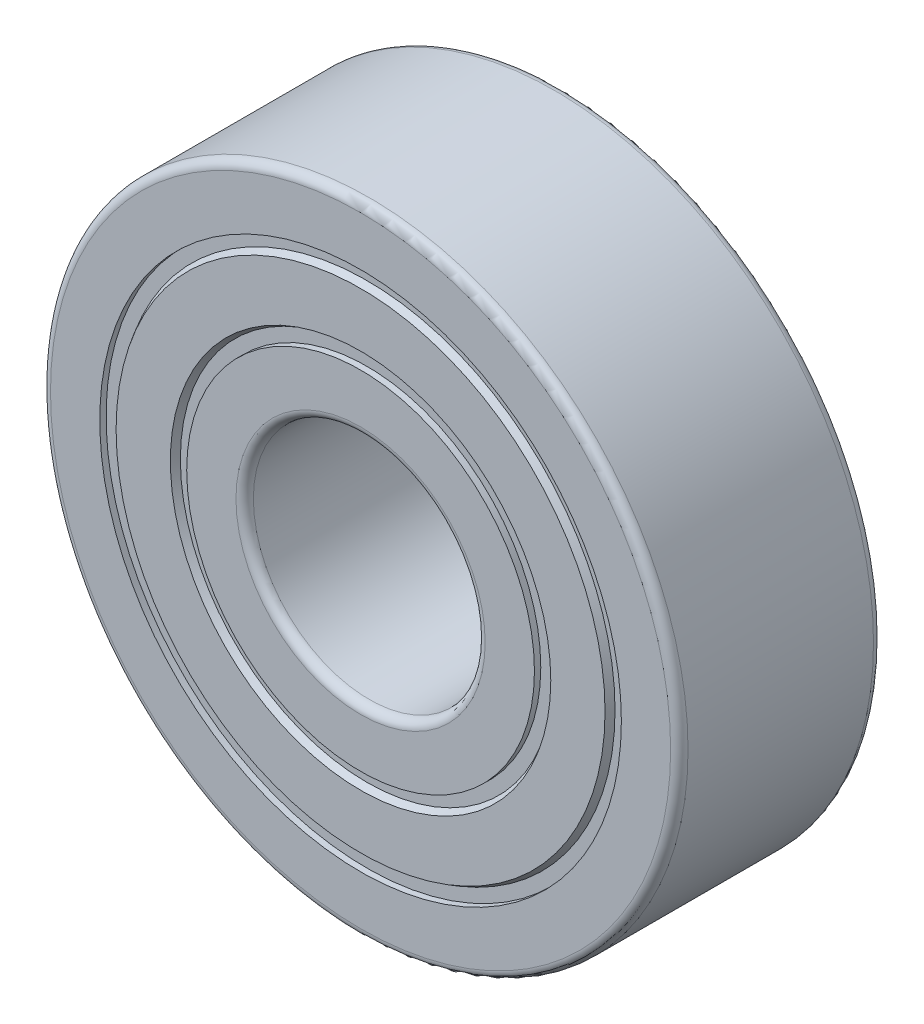
ISO-10303-21;
HEADER;
FILE_DESCRIPTION(('STEP AP214'),'2;1');
FILE_NAME('part.step','',(''),(''),'','','');
FILE_SCHEMA(('AUTOMOTIVE_DESIGN { 1 0 10303 214 1 1 1 1 }'));
ENDSEC;
DATA;
#1=APPLICATION_CONTEXT('core data for automotive mechanical design processes');
#2=APPLICATION_PROTOCOL_DEFINITION('international standard','automotive_design',2000,#1);
#3=PRODUCT_CONTEXT('',#1,'mechanical');
#4=PRODUCT('Part','Part','',(#3));
#5=PRODUCT_RELATED_PRODUCT_CATEGORY('part','',(#4));
#6=PRODUCT_DEFINITION_FORMATION('','',#4);
#7=PRODUCT_DEFINITION_CONTEXT('part definition',#1,'design');
#8=PRODUCT_DEFINITION('design','',#6,#7);
#9=PRODUCT_DEFINITION_SHAPE('','',#8);
#10=(LENGTH_UNIT() NAMED_UNIT(*) SI_UNIT(.MILLI.,.METRE.));
#11=(NAMED_UNIT(*) PLANE_ANGLE_UNIT() SI_UNIT($,.RADIAN.));
#12=(NAMED_UNIT(*) SI_UNIT($,.STERADIAN.) SOLID_ANGLE_UNIT());
#13=UNCERTAINTY_MEASURE_WITH_UNIT(LENGTH_MEASURE(1.E-05),#10,'distance_accuracy_value','');
#14=(GEOMETRIC_REPRESENTATION_CONTEXT(3) GLOBAL_UNCERTAINTY_ASSIGNED_CONTEXT((#13)) GLOBAL_UNIT_ASSIGNED_CONTEXT((#10,
#11,#12)) REPRESENTATION_CONTEXT('',''));
#15=CARTESIAN_POINT('',(0.,0.,0.));
#16=DIRECTION('',(0.,0.,1.));
#17=DIRECTION('',(1.,0.,0.));
#18=AXIS2_PLACEMENT_3D('',#15,#16,#17);
#19=CARTESIAN_POINT('',(-9.,0.,7.));
#20=DIRECTION('',(0.,0.,-1.));
#21=DIRECTION('',(-1.,0.,0.));
#22=AXIS2_PLACEMENT_3D('',#19,#20,#21);
#23=PLANE('',#22);
#24=CARTESIAN_POINT('',(0.,0.,7.));
#25=DIRECTION('',(0.,0.,1.));
#26=DIRECTION('',(1.,0.,0.));
#27=AXIS2_PLACEMENT_3D('',#24,#25,#26);
#28=CIRCLE('',#27,9.);
#29=CARTESIAN_POINT('',(9.,0.,7.));
#30=VERTEX_POINT('',#29);
#31=EDGE_CURVE('E10',#30,#30,#28,.T.);
#32=ORIENTED_EDGE('',*,*,#31,.F.);
#33=EDGE_LOOP('',(#32));
#34=FACE_BOUND('',#33,.T.);
#35=CARTESIAN_POINT('',(0.,0.,7.));
#36=DIRECTION('',(0.,0.,1.));
#37=DIRECTION('',(1.,0.,0.));
#38=AXIS2_PLACEMENT_3D('',#35,#36,#37);
#39=CIRCLE('',#38,10.7);
#40=CARTESIAN_POINT('',(10.7,0.,7.));
#41=VERTEX_POINT('',#40);
#42=EDGE_CURVE('E110',#41,#41,#39,.T.);
#43=ORIENTED_EDGE('',*,*,#42,.T.);
#44=EDGE_LOOP('',(#43));
#45=FACE_BOUND('',#44,.T.);
#46=ADVANCED_FACE('F33',(#34,#45),#23,.F.);
#47=CARTESIAN_POINT('',(0.,0.,19.));
#48=DIRECTION('',(0.,0.,1.));
#49=DIRECTION('',(1.,0.,0.));
#50=AXIS2_PLACEMENT_3D('',#47,#48,#49);
#51=CYLINDRICAL_SURFACE('',#50,9.);
#52=CARTESIAN_POINT('',(0.,0.,6.78125));
#53=DIRECTION('',(0.,0.,1.));
#54=DIRECTION('',(1.,0.,0.));
#55=AXIS2_PLACEMENT_3D('',#52,#53,#54);
#56=CIRCLE('',#55,9.);
#57=CARTESIAN_POINT('',(9.,0.,6.78125));
#58=VERTEX_POINT('',#57);
#59=EDGE_CURVE('E40',#58,#58,#56,.T.);
#60=ORIENTED_EDGE('',*,*,#59,.F.);
#61=EDGE_LOOP('',(#60));
#62=FACE_BOUND('',#61,.T.);
#63=ORIENTED_EDGE('',*,*,#31,.T.);
#64=EDGE_LOOP('',(#63));
#65=FACE_BOUND('',#64,.T.);
#66=ADVANCED_FACE('F243',(#62,#65),#51,.F.);
#67=CARTESIAN_POINT('',(-9.,0.,6.78125));
#68=DIRECTION('',(0.,0.,-1.));
#69=DIRECTION('',(-1.,0.,0.));
#70=AXIS2_PLACEMENT_3D('',#67,#68,#69);
#71=PLANE('',#70);
#72=CARTESIAN_POINT('',(0.,0.,6.78125));
#73=DIRECTION('',(0.,0.,1.));
#74=DIRECTION('',(1.,0.,0.));
#75=AXIS2_PLACEMENT_3D('',#72,#73,#74);
#76=CIRCLE('',#75,8.5625);
#77=CARTESIAN_POINT('',(8.5625,0.,6.78125));
#78=VERTEX_POINT('',#77);
#79=EDGE_CURVE('E44',#78,#78,#76,.T.);
#80=ORIENTED_EDGE('',*,*,#79,.F.);
#81=EDGE_LOOP('',(#80));
#82=FACE_BOUND('',#81,.T.);
#83=ORIENTED_EDGE('',*,*,#59,.T.);
#84=EDGE_LOOP('',(#83));
#85=FACE_BOUND('',#84,.T.);
#86=ADVANCED_FACE('F238',(#82,#85),#71,.F.);
#87=CARTESIAN_POINT('',(0.,0.,6.78125));
#88=DIRECTION('',(0.,0.,-1.));
#89=DIRECTION('',(-1.,0.,0.));
#90=AXIS2_PLACEMENT_3D('',#87,#88,#89);
#91=CONICAL_SURFACE('',#90,8.5625,0.523598775598308);
#92=CARTESIAN_POINT('',(0.,0.,7.));
#93=DIRECTION('',(0.,0.,1.));
#94=DIRECTION('',(1.,0.,0.));
#95=AXIS2_PLACEMENT_3D('',#92,#93,#94);
#96=CIRCLE('',#95,8.43620462861477);
#97=CARTESIAN_POINT('',(8.43620462861477,0.,7.));
#98=VERTEX_POINT('',#97);
#99=EDGE_CURVE('E48',#98,#98,#96,.T.);
#100=ORIENTED_EDGE('',*,*,#99,.F.);
#101=EDGE_LOOP('',(#100));
#102=FACE_BOUND('',#101,.T.);
#103=ORIENTED_EDGE('',*,*,#79,.T.);
#104=EDGE_LOOP('',(#103));
#105=FACE_BOUND('',#104,.T.);
#106=ADVANCED_FACE('F232',(#102,#105),#91,.T.);
#107=CARTESIAN_POINT('',(-8.43620462861477,0.,7.));
#108=DIRECTION('',(0.,0.,-1.));
#109=DIRECTION('',(-1.,0.,0.));
#110=AXIS2_PLACEMENT_3D('',#107,#108,#109);
#111=PLANE('',#110);
#112=CARTESIAN_POINT('',(0.,0.,7.));
#113=DIRECTION('',(0.,0.,1.));
#114=DIRECTION('',(1.,0.,0.));
#115=AXIS2_PLACEMENT_3D('',#112,#113,#114);
#116=CIRCLE('',#115,6.56379537138523);
#117=CARTESIAN_POINT('',(6.56379537138523,0.,7.));
#118=VERTEX_POINT('',#117);
#119=EDGE_CURVE('E53',#118,#118,#116,.T.);
#120=ORIENTED_EDGE('',*,*,#119,.F.);
#121=EDGE_LOOP('',(#120));
#122=FACE_BOUND('',#121,.T.);
#123=ORIENTED_EDGE('',*,*,#99,.T.);
#124=EDGE_LOOP('',(#123));
#125=FACE_BOUND('',#124,.T.);
#126=ADVANCED_FACE('F226',(#122,#125),#111,.F.);
#127=CARTESIAN_POINT('',(0.,0.,7.));
#128=DIRECTION('',(0.,0.,1.));
#129=DIRECTION('',(1.,0.,0.));
#130=AXIS2_PLACEMENT_3D('',#127,#128,#129);
#131=CONICAL_SURFACE('',#130,6.56379537138523,0.523598775598303);
#132=CARTESIAN_POINT('',(0.,0.,6.78125));
#133=DIRECTION('',(0.,0.,1.));
#134=DIRECTION('',(1.,0.,0.));
#135=AXIS2_PLACEMENT_3D('',#132,#133,#134);
#136=CIRCLE('',#135,6.4375);
#137=CARTESIAN_POINT('',(6.4375,0.,6.78125));
#138=VERTEX_POINT('',#137);
#139=EDGE_CURVE('E56',#138,#138,#136,.T.);
#140=ORIENTED_EDGE('',*,*,#139,.F.);
#141=EDGE_LOOP('',(#140));
#142=FACE_BOUND('',#141,.T.);
#143=ORIENTED_EDGE('',*,*,#119,.T.);
#144=EDGE_LOOP('',(#143));
#145=FACE_BOUND('',#144,.T.);
#146=ADVANCED_FACE('F220',(#142,#145),#131,.F.);
#147=CARTESIAN_POINT('',(-6.,0.,6.78125));
#148=DIRECTION('',(0.,0.,-1.));
#149=DIRECTION('',(-1.,0.,0.));
#150=AXIS2_PLACEMENT_3D('',#147,#148,#149);
#151=PLANE('',#150);
#152=CARTESIAN_POINT('',(0.,0.,6.78125));
#153=DIRECTION('',(0.,0.,1.));
#154=DIRECTION('',(1.,0.,0.));
#155=AXIS2_PLACEMENT_3D('',#152,#153,#154);
#156=CIRCLE('',#155,6.);
#157=CARTESIAN_POINT('',(6.,0.,6.78125));
#158=VERTEX_POINT('',#157);
#159=EDGE_CURVE('E59',#158,#158,#156,.T.);
#160=ORIENTED_EDGE('',*,*,#159,.F.);
#161=EDGE_LOOP('',(#160));
#162=FACE_BOUND('',#161,.T.);
#163=ORIENTED_EDGE('',*,*,#139,.T.);
#164=EDGE_LOOP('',(#163));
#165=FACE_BOUND('',#164,.T.);
#166=ADVANCED_FACE('F214',(#162,#165),#151,.F.);
#167=CARTESIAN_POINT('',(0.,0.,19.));
#168=DIRECTION('',(0.,0.,1.));
#169=DIRECTION('',(1.,0.,0.));
#170=AXIS2_PLACEMENT_3D('',#167,#168,#169);
#171=CYLINDRICAL_SURFACE('',#170,6.);
#172=CARTESIAN_POINT('',(0.,0.,7.));
#173=DIRECTION('',(0.,0.,1.));
#174=DIRECTION('',(1.,0.,0.));
#175=AXIS2_PLACEMENT_3D('',#172,#173,#174);
#176=CIRCLE('',#175,6.);
#177=CARTESIAN_POINT('',(6.,0.,7.));
#178=VERTEX_POINT('',#177);
#179=EDGE_CURVE('E62',#178,#178,#176,.T.);
#180=ORIENTED_EDGE('',*,*,#179,.F.);
#181=EDGE_LOOP('',(#180));
#182=FACE_BOUND('',#181,.T.);
#183=ORIENTED_EDGE('',*,*,#159,.T.);
#184=EDGE_LOOP('',(#183));
#185=FACE_BOUND('',#184,.T.);
#186=ADVANCED_FACE('F208',(#182,#185),#171,.T.);
#187=CARTESIAN_POINT('',(-4.3,0.,7.));
#188=DIRECTION('',(0.,0.,-1.));
#189=DIRECTION('',(-1.,0.,0.));
#190=AXIS2_PLACEMENT_3D('',#187,#188,#189);
#191=PLANE('',#190);
#192=CARTESIAN_POINT('',(0.,0.,7.));
#193=DIRECTION('',(0.,0.,1.));
#194=DIRECTION('',(1.,0.,0.));
#195=AXIS2_PLACEMENT_3D('',#192,#193,#194);
#196=CIRCLE('',#195,4.3);
#197=CARTESIAN_POINT('',(4.3,0.,7.));
#198=VERTEX_POINT('',#197);
#199=EDGE_CURVE('E65',#198,#198,#196,.T.);
#200=ORIENTED_EDGE('',*,*,#199,.F.);
#201=EDGE_LOOP('',(#200));
#202=FACE_BOUND('',#201,.T.);
#203=ORIENTED_EDGE('',*,*,#179,.T.);
#204=EDGE_LOOP('',(#203));
#205=FACE_BOUND('',#204,.T.);
#206=ADVANCED_FACE('F202',(#202,#205),#191,.F.);
#207=CARTESIAN_POINT('',(0.,0.,6.7));
#208=DIRECTION('',(0.,0.,1.));
#209=DIRECTION('',(1.,0.,0.));
#210=AXIS2_PLACEMENT_3D('',#207,#208,#209);
#211=TOROIDAL_SURFACE('',#210,4.3,0.3);
#212=CARTESIAN_POINT('',(0.,0.,6.7));
#213=DIRECTION('',(0.,0.,1.));
#214=DIRECTION('',(1.,0.,0.));
#215=AXIS2_PLACEMENT_3D('',#212,#213,#214);
#216=CIRCLE('',#215,4.);
#217=CARTESIAN_POINT('',(4.,0.,6.7));
#218=VERTEX_POINT('',#217);
#219=EDGE_CURVE('E68',#218,#218,#216,.T.);
#220=ORIENTED_EDGE('',*,*,#219,.F.);
#221=EDGE_LOOP('',(#220));
#222=FACE_BOUND('',#221,.T.);
#223=ORIENTED_EDGE('',*,*,#199,.T.);
#224=EDGE_LOOP('',(#223));
#225=FACE_BOUND('',#224,.T.);
#226=ADVANCED_FACE('F196',(#222,#225),#211,.T.);
#227=CARTESIAN_POINT('',(0.,0.,19.));
#228=DIRECTION('',(0.,0.,1.));
#229=DIRECTION('',(1.,0.,0.));
#230=AXIS2_PLACEMENT_3D('',#227,#228,#229);
#231=CYLINDRICAL_SURFACE('',#230,4.);
#232=CARTESIAN_POINT('',(0.,0.,0.300000000000002));
#233=DIRECTION('',(0.,0.,1.));
#234=DIRECTION('',(1.,0.,0.));
#235=AXIS2_PLACEMENT_3D('',#232,#233,#234);
#236=CIRCLE('',#235,4.);
#237=CARTESIAN_POINT('',(4.,0.,0.300000000000002));
#238=VERTEX_POINT('',#237);
#239=EDGE_CURVE('E71',#238,#238,#236,.T.);
#240=ORIENTED_EDGE('',*,*,#239,.F.);
#241=EDGE_LOOP('',(#240));
#242=FACE_BOUND('',#241,.T.);
#243=ORIENTED_EDGE('',*,*,#219,.T.);
#244=EDGE_LOOP('',(#243));
#245=FACE_BOUND('',#244,.T.);
#246=ADVANCED_FACE('F190',(#242,#245),#231,.F.);
#247=CARTESIAN_POINT('',(0.,0.,0.300000000000001));
#248=DIRECTION('',(0.,0.,1.));
#249=DIRECTION('',(1.,0.,0.));
#250=AXIS2_PLACEMENT_3D('',#247,#248,#249);
#251=TOROIDAL_SURFACE('',#250,4.3,0.3);
#252=CARTESIAN_POINT('',(0.,0.,0.));
#253=DIRECTION('',(0.,0.,1.));
#254=DIRECTION('',(1.,0.,0.));
#255=AXIS2_PLACEMENT_3D('',#252,#253,#254);
#256=CIRCLE('',#255,4.3);
#257=CARTESIAN_POINT('',(4.3,0.,0.));
#258=VERTEX_POINT('',#257);
#259=EDGE_CURVE('E74',#258,#258,#256,.T.);
#260=ORIENTED_EDGE('',*,*,#259,.F.);
#261=EDGE_LOOP('',(#260));
#262=FACE_BOUND('',#261,.T.);
#263=ORIENTED_EDGE('',*,*,#239,.T.);
#264=EDGE_LOOP('',(#263));
#265=FACE_BOUND('',#264,.T.);
#266=ADVANCED_FACE('F184',(#262,#265),#251,.T.);
#267=CARTESIAN_POINT('',(-4.3,0.,0.));
#268=DIRECTION('',(0.,0.,1.));
#269=DIRECTION('',(1.,0.,0.));
#270=AXIS2_PLACEMENT_3D('',#267,#268,#269);
#271=PLANE('',#270);
#272=CARTESIAN_POINT('',(0.,0.,0.));
#273=DIRECTION('',(0.,0.,1.));
#274=DIRECTION('',(1.,0.,0.));
#275=AXIS2_PLACEMENT_3D('',#272,#273,#274);
#276=CIRCLE('',#275,6.);
#277=CARTESIAN_POINT('',(6.,0.,0.));
#278=VERTEX_POINT('',#277);
#279=EDGE_CURVE('E77',#278,#278,#276,.T.);
#280=ORIENTED_EDGE('',*,*,#279,.F.);
#281=EDGE_LOOP('',(#280));
#282=FACE_BOUND('',#281,.T.);
#283=ORIENTED_EDGE('',*,*,#259,.T.);
#284=EDGE_LOOP('',(#283));
#285=FACE_BOUND('',#284,.T.);
#286=ADVANCED_FACE('F178',(#282,#285),#271,.F.);
#287=CARTESIAN_POINT('',(0.,0.,19.));
#288=DIRECTION('',(0.,0.,1.));
#289=DIRECTION('',(1.,0.,0.));
#290=AXIS2_PLACEMENT_3D('',#287,#288,#289);
#291=CYLINDRICAL_SURFACE('',#290,6.);
#292=CARTESIAN_POINT('',(0.,0.,0.21875));
#293=DIRECTION('',(0.,0.,1.));
#294=DIRECTION('',(1.,0.,0.));
#295=AXIS2_PLACEMENT_3D('',#292,#293,#294);
#296=CIRCLE('',#295,6.);
#297=CARTESIAN_POINT('',(6.,0.,0.21875));
#298=VERTEX_POINT('',#297);
#299=EDGE_CURVE('E80',#298,#298,#296,.T.);
#300=ORIENTED_EDGE('',*,*,#299,.F.);
#301=EDGE_LOOP('',(#300));
#302=FACE_BOUND('',#301,.T.);
#303=ORIENTED_EDGE('',*,*,#279,.T.);
#304=EDGE_LOOP('',(#303));
#305=FACE_BOUND('',#304,.T.);
#306=ADVANCED_FACE('F172',(#302,#305),#291,.T.);
#307=CARTESIAN_POINT('',(-6.,0.,0.21875));
#308=DIRECTION('',(0.,0.,1.));
#309=DIRECTION('',(1.,0.,0.));
#310=AXIS2_PLACEMENT_3D('',#307,#308,#309);
#311=PLANE('',#310);
#312=CARTESIAN_POINT('',(0.,0.,0.21875));
#313=DIRECTION('',(0.,0.,1.));
#314=DIRECTION('',(1.,0.,0.));
#315=AXIS2_PLACEMENT_3D('',#312,#313,#314);
#316=CIRCLE('',#315,6.4375);
#317=CARTESIAN_POINT('',(6.4375,0.,0.21875));
#318=VERTEX_POINT('',#317);
#319=EDGE_CURVE('E83',#318,#318,#316,.T.);
#320=ORIENTED_EDGE('',*,*,#319,.F.);
#321=EDGE_LOOP('',(#320));
#322=FACE_BOUND('',#321,.T.);
#323=ORIENTED_EDGE('',*,*,#299,.T.);
#324=EDGE_LOOP('',(#323));
#325=FACE_BOUND('',#324,.T.);
#326=ADVANCED_FACE('F166',(#322,#325),#311,.F.);
#327=CARTESIAN_POINT('',(0.,0.,0.21875));
#328=DIRECTION('',(0.,0.,-1.));
#329=DIRECTION('',(-1.,0.,0.));
#330=AXIS2_PLACEMENT_3D('',#327,#328,#329);
#331=CONICAL_SURFACE('',#330,6.4375,0.523598775598303);
#332=CARTESIAN_POINT('',(0.,0.,0.));
#333=DIRECTION('',(0.,0.,1.));
#334=DIRECTION('',(1.,0.,0.));
#335=AXIS2_PLACEMENT_3D('',#332,#333,#334);
#336=CIRCLE('',#335,6.56379537138523);
#337=CARTESIAN_POINT('',(6.56379537138523,0.,0.));
#338=VERTEX_POINT('',#337);
#339=EDGE_CURVE('E86',#338,#338,#336,.T.);
#340=ORIENTED_EDGE('',*,*,#339,.F.);
#341=EDGE_LOOP('',(#340));
#342=FACE_BOUND('',#341,.T.);
#343=ORIENTED_EDGE('',*,*,#319,.T.);
#344=EDGE_LOOP('',(#343));
#345=FACE_BOUND('',#344,.T.);
#346=ADVANCED_FACE('F160',(#342,#345),#331,.F.);
#347=CARTESIAN_POINT('',(-8.43620462861477,0.,0.));
#348=DIRECTION('',(0.,0.,1.));
#349=DIRECTION('',(1.,0.,0.));
#350=AXIS2_PLACEMENT_3D('',#347,#348,#349);
#351=PLANE('',#350);
#352=CARTESIAN_POINT('',(0.,0.,0.));
#353=DIRECTION('',(0.,0.,1.));
#354=DIRECTION('',(1.,0.,0.));
#355=AXIS2_PLACEMENT_3D('',#352,#353,#354);
#356=CIRCLE('',#355,8.43620462861477);
#357=CARTESIAN_POINT('',(8.43620462861477,0.,0.));
#358=VERTEX_POINT('',#357);
#359=EDGE_CURVE('E89',#358,#358,#356,.T.);
#360=ORIENTED_EDGE('',*,*,#359,.F.);
#361=EDGE_LOOP('',(#360));
#362=FACE_BOUND('',#361,.T.);
#363=ORIENTED_EDGE('',*,*,#339,.T.);
#364=EDGE_LOOP('',(#363));
#365=FACE_BOUND('',#364,.T.);
#366=ADVANCED_FACE('F154',(#362,#365),#351,.F.);
#367=CARTESIAN_POINT('',(0.,0.,0.));
#368=DIRECTION('',(0.,0.,1.));
#369=DIRECTION('',(1.,0.,0.));
#370=AXIS2_PLACEMENT_3D('',#367,#368,#369);
#371=CONICAL_SURFACE('',#370,8.43620462861477,0.523598775598308);
#372=CARTESIAN_POINT('',(0.,0.,0.21875));
#373=DIRECTION('',(0.,0.,1.));
#374=DIRECTION('',(1.,0.,0.));
#375=AXIS2_PLACEMENT_3D('',#372,#373,#374);
#376=CIRCLE('',#375,8.5625);
#377=CARTESIAN_POINT('',(8.5625,0.,0.21875));
#378=VERTEX_POINT('',#377);
#379=EDGE_CURVE('E92',#378,#378,#376,.T.);
#380=ORIENTED_EDGE('',*,*,#379,.F.);
#381=EDGE_LOOP('',(#380));
#382=FACE_BOUND('',#381,.T.);
#383=ORIENTED_EDGE('',*,*,#359,.T.);
#384=EDGE_LOOP('',(#383));
#385=FACE_BOUND('',#384,.T.);
#386=ADVANCED_FACE('F148',(#382,#385),#371,.T.);
#387=CARTESIAN_POINT('',(-9.,0.,0.21875));
#388=DIRECTION('',(0.,0.,1.));
#389=DIRECTION('',(1.,0.,0.));
#390=AXIS2_PLACEMENT_3D('',#387,#388,#389);
#391=PLANE('',#390);
#392=CARTESIAN_POINT('',(0.,0.,0.21875));
#393=DIRECTION('',(0.,0.,1.));
#394=DIRECTION('',(1.,0.,0.));
#395=AXIS2_PLACEMENT_3D('',#392,#393,#394);
#396=CIRCLE('',#395,9.);
#397=CARTESIAN_POINT('',(9.,0.,0.21875));
#398=VERTEX_POINT('',#397);
#399=EDGE_CURVE('E95',#398,#398,#396,.T.);
#400=ORIENTED_EDGE('',*,*,#399,.F.);
#401=EDGE_LOOP('',(#400));
#402=FACE_BOUND('',#401,.T.);
#403=ORIENTED_EDGE('',*,*,#379,.T.);
#404=EDGE_LOOP('',(#403));
#405=FACE_BOUND('',#404,.T.);
#406=ADVANCED_FACE('F142',(#402,#405),#391,.F.);
#407=CARTESIAN_POINT('',(0.,0.,19.));
#408=DIRECTION('',(0.,0.,1.));
#409=DIRECTION('',(1.,0.,0.));
#410=AXIS2_PLACEMENT_3D('',#407,#408,#409);
#411=CYLINDRICAL_SURFACE('',#410,9.);
#412=CARTESIAN_POINT('',(0.,0.,0.));
#413=DIRECTION('',(0.,0.,1.));
#414=DIRECTION('',(1.,0.,0.));
#415=AXIS2_PLACEMENT_3D('',#412,#413,#414);
#416=CIRCLE('',#415,9.);
#417=CARTESIAN_POINT('',(9.,0.,0.));
#418=VERTEX_POINT('',#417);
#419=EDGE_CURVE('E98',#418,#418,#416,.T.);
#420=ORIENTED_EDGE('',*,*,#419,.F.);
#421=EDGE_LOOP('',(#420));
#422=FACE_BOUND('',#421,.T.);
#423=ORIENTED_EDGE('',*,*,#399,.T.);
#424=EDGE_LOOP('',(#423));
#425=FACE_BOUND('',#424,.T.);
#426=ADVANCED_FACE('F136',(#422,#425),#411,.F.);
#427=CARTESIAN_POINT('',(-9.,0.,0.));
#428=DIRECTION('',(0.,0.,1.));
#429=DIRECTION('',(1.,0.,0.));
#430=AXIS2_PLACEMENT_3D('',#427,#428,#429);
#431=PLANE('',#430);
#432=CARTESIAN_POINT('',(0.,0.,0.));
#433=DIRECTION('',(0.,0.,1.));
#434=DIRECTION('',(1.,0.,0.));
#435=AXIS2_PLACEMENT_3D('',#432,#433,#434);
#436=CIRCLE('',#435,10.7);
#437=CARTESIAN_POINT('',(10.7,0.,0.));
#438=VERTEX_POINT('',#437);
#439=EDGE_CURVE('E101',#438,#438,#436,.T.);
#440=ORIENTED_EDGE('',*,*,#439,.F.);
#441=EDGE_LOOP('',(#440));
#442=FACE_BOUND('',#441,.T.);
#443=ORIENTED_EDGE('',*,*,#419,.T.);
#444=EDGE_LOOP('',(#443));
#445=FACE_BOUND('',#444,.T.);
#446=ADVANCED_FACE('F130',(#442,#445),#431,.F.);
#447=CARTESIAN_POINT('',(0.,0.,0.299999999999999));
#448=DIRECTION('',(0.,0.,1.));
#449=DIRECTION('',(1.,0.,0.));
#450=AXIS2_PLACEMENT_3D('',#447,#448,#449);
#451=TOROIDAL_SURFACE('',#450,10.7,0.3);
#452=CARTESIAN_POINT('',(0.,0.,0.299999999999998));
#453=DIRECTION('',(0.,0.,1.));
#454=DIRECTION('',(1.,0.,0.));
#455=AXIS2_PLACEMENT_3D('',#452,#453,#454);
#456=CIRCLE('',#455,11.);
#457=CARTESIAN_POINT('',(11.,0.,0.299999999999998));
#458=VERTEX_POINT('',#457);
#459=EDGE_CURVE('E104',#458,#458,#456,.T.);
#460=ORIENTED_EDGE('',*,*,#459,.F.);
#461=EDGE_LOOP('',(#460));
#462=FACE_BOUND('',#461,.T.);
#463=ORIENTED_EDGE('',*,*,#439,.T.);
#464=EDGE_LOOP('',(#463));
#465=FACE_BOUND('',#464,.T.);
#466=ADVANCED_FACE('F124',(#462,#465),#451,.T.);
#467=CARTESIAN_POINT('',(0.,0.,19.));
#468=DIRECTION('',(0.,0.,1.));
#469=DIRECTION('',(1.,0.,0.));
#470=AXIS2_PLACEMENT_3D('',#467,#468,#469);
#471=CYLINDRICAL_SURFACE('',#470,11.);
#472=CARTESIAN_POINT('',(0.,0.,6.7));
#473=DIRECTION('',(0.,0.,1.));
#474=DIRECTION('',(1.,0.,0.));
#475=AXIS2_PLACEMENT_3D('',#472,#473,#474);
#476=CIRCLE('',#475,11.);
#477=CARTESIAN_POINT('',(11.,0.,6.7));
#478=VERTEX_POINT('',#477);
#479=EDGE_CURVE('E107',#478,#478,#476,.T.);
#480=ORIENTED_EDGE('',*,*,#479,.F.);
#481=EDGE_LOOP('',(#480));
#482=FACE_BOUND('',#481,.T.);
#483=ORIENTED_EDGE('',*,*,#459,.T.);
#484=EDGE_LOOP('',(#483));
#485=FACE_BOUND('',#484,.T.);
#486=ADVANCED_FACE('F118',(#482,#485),#471,.T.);
#487=CARTESIAN_POINT('',(0.,0.,6.7));
#488=DIRECTION('',(0.,0.,1.));
#489=DIRECTION('',(1.,0.,0.));
#490=AXIS2_PLACEMENT_3D('',#487,#488,#489);
#491=TOROIDAL_SURFACE('',#490,10.7,0.3);
#492=ORIENTED_EDGE('',*,*,#42,.F.);
#493=EDGE_LOOP('',(#492));
#494=FACE_BOUND('',#493,.T.);
#495=ORIENTED_EDGE('',*,*,#479,.T.);
#496=EDGE_LOOP('',(#495));
#497=FACE_BOUND('',#496,.T.);
#498=ADVANCED_FACE('F115',(#494,#497),#491,.T.);
#499=CLOSED_SHELL('',(#46,#66,#86,#106,#126,#146,#166,#186,#206,#226,#246,#266,#286,#306,#326,
#346,#366,#386,#406,#426,#446,#466,#486,#498));
#500=CARTESIAN_POINT('',(0.,0.,3.5));
#501=DIRECTION('',(0.,0.,1.));
#502=DIRECTION('',(1.,0.,0.));
#503=AXIS2_PLACEMENT_3D('',#500,#501,#502);
#504=TOROIDAL_SURFACE('',#503,7.5,2.1875);
#505=CARTESIAN_POINT('',(9.6875,0.,3.5));
#506=VERTEX_POINT('',#505);
#507=VERTEX_LOOP('',#506);
#508=FACE_BOUND('',#507,.T.);
#509=ADVANCED_FACE('F405',(#508),#504,.F.);
#510=CLOSED_SHELL('',(#509));
#511=ORIENTED_CLOSED_SHELL('',*,#510,.T.);
#512=BREP_WITH_VOIDS('B2',#499,(#511));
#513=ADVANCED_BREP_SHAPE_REPRESENTATION('',(#18,#512),#14);
#514=SHAPE_DEFINITION_REPRESENTATION(#9,#513);
ENDSEC;
END-ISO-10303-21;
